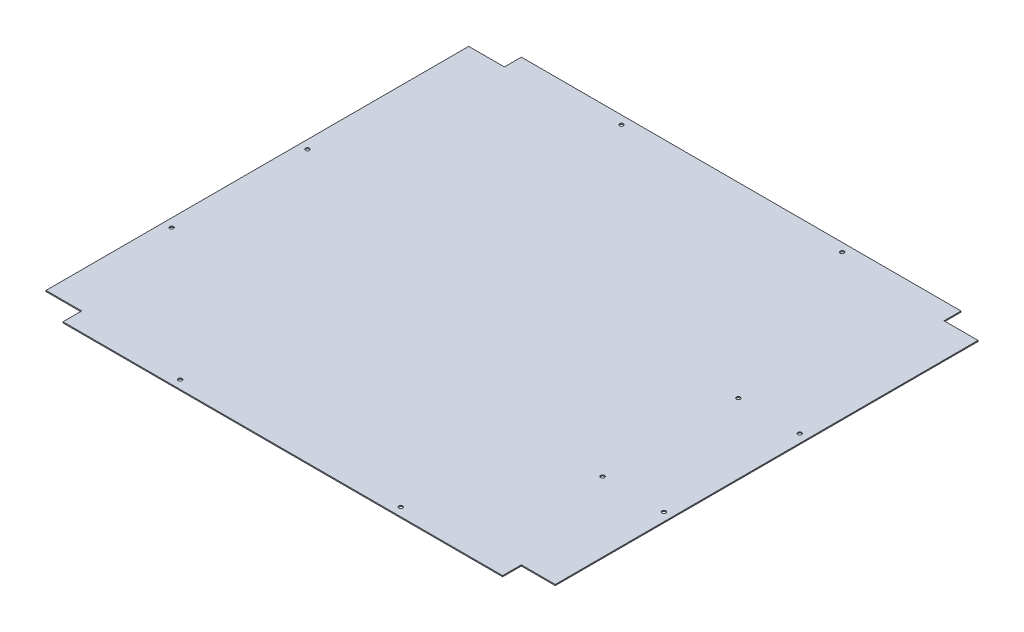
ISO-10303-21;
HEADER;
FILE_DESCRIPTION(('STEP AP214'),'2;1');
FILE_NAME('part.step','',(''),(''),'','','');
FILE_SCHEMA(('AUTOMOTIVE_DESIGN { 1 0 10303 214 1 1 1 1 }'));
ENDSEC;
DATA;
#1=APPLICATION_CONTEXT('core data for automotive mechanical design processes');
#2=APPLICATION_PROTOCOL_DEFINITION('international standard','automotive_design',2000,#1);
#3=PRODUCT_CONTEXT('',#1,'mechanical');
#4=PRODUCT('Part','Part','',(#3));
#5=PRODUCT_RELATED_PRODUCT_CATEGORY('part','',(#4));
#6=PRODUCT_DEFINITION_FORMATION('','',#4);
#7=PRODUCT_DEFINITION_CONTEXT('part definition',#1,'design');
#8=PRODUCT_DEFINITION('design','',#6,#7);
#9=PRODUCT_DEFINITION_SHAPE('','',#8);
#10=(LENGTH_UNIT() NAMED_UNIT(*) SI_UNIT(.MILLI.,.METRE.));
#11=(NAMED_UNIT(*) PLANE_ANGLE_UNIT() SI_UNIT($,.RADIAN.));
#12=(NAMED_UNIT(*) SI_UNIT($,.STERADIAN.) SOLID_ANGLE_UNIT());
#13=UNCERTAINTY_MEASURE_WITH_UNIT(LENGTH_MEASURE(1.E-05),#10,'distance_accuracy_value','');
#14=(GEOMETRIC_REPRESENTATION_CONTEXT(3) GLOBAL_UNCERTAINTY_ASSIGNED_CONTEXT((#13)) GLOBAL_UNIT_ASSIGNED_CONTEXT((#10,
#11,#12)) REPRESENTATION_CONTEXT('',''));
#15=CARTESIAN_POINT('',(0.,0.,0.));
#16=DIRECTION('',(0.,0.,1.));
#17=DIRECTION('',(1.,0.,0.));
#18=AXIS2_PLACEMENT_3D('',#15,#16,#17);
#19=CARTESIAN_POINT('',(0.,-1.5875,0.));
#20=DIRECTION('',(-1.,0.,0.));
#21=DIRECTION('',(0.,0.,1.));
#22=AXIS2_PLACEMENT_3D('',#19,#20,#21);
#23=PLANE('',#22);
#24=DIRECTION('',(0.,0.,1.));
#25=VECTOR('',#24,1.);
#26=CARTESIAN_POINT('',(0.,-1.5875,0.));
#27=LINE('',#26,#25);
#28=CARTESIAN_POINT('',(0.,-1.5875,-660.4));
#29=VERTEX_POINT('',#28);
#30=CARTESIAN_POINT('',(0.,-1.5875,-27.94));
#31=VERTEX_POINT('',#30);
#32=EDGE_CURVE('E261',#29,#31,#27,.T.);
#33=ORIENTED_EDGE('',*,*,#32,.F.);
#34=DIRECTION('',(0.,1.,0.));
#35=VECTOR('',#34,1.);
#36=CARTESIAN_POINT('',(0.,-1.5875,-660.4));
#37=LINE('',#36,#35);
#38=CARTESIAN_POINT('',(0.,0.,-660.4));
#39=VERTEX_POINT('',#38);
#40=EDGE_CURVE('E128',#29,#39,#37,.T.);
#41=ORIENTED_EDGE('',*,*,#40,.T.);
#42=DIRECTION('',(0.,0.,1.));
#43=VECTOR('',#42,1.);
#44=CARTESIAN_POINT('',(0.,0.,0.));
#45=LINE('',#44,#43);
#46=CARTESIAN_POINT('',(0.,0.,-27.94));
#47=VERTEX_POINT('',#46);
#48=EDGE_CURVE('E57',#39,#47,#45,.T.);
#49=ORIENTED_EDGE('',*,*,#48,.T.);
#50=DIRECTION('',(0.,-1.,0.));
#51=VECTOR('',#50,1.);
#52=CARTESIAN_POINT('',(0.,-1.5875,-27.94));
#53=LINE('',#52,#51);
#54=EDGE_CURVE('E163',#47,#31,#53,.T.);
#55=ORIENTED_EDGE('',*,*,#54,.T.);
#56=EDGE_LOOP('',(#33,#41,#49,#55));
#57=FACE_BOUND('',#56,.T.);
#58=ADVANCED_FACE('F35',(#57),#23,.F.);
#59=CARTESIAN_POINT('',(0.,-1.5875,0.));
#60=DIRECTION('',(0.,0.,-1.));
#61=DIRECTION('',(-1.,0.,0.));
#62=AXIS2_PLACEMENT_3D('',#59,#60,#61);
#63=PLANE('',#62);
#64=DIRECTION('',(-1.,0.,0.));
#65=VECTOR('',#64,1.);
#66=CARTESIAN_POINT('',(0.,-1.5875,0.));
#67=LINE('',#66,#65);
#68=CARTESIAN_POINT('',(-50.8000000000001,-1.5875,0.));
#69=VERTEX_POINT('',#68);
#70=CARTESIAN_POINT('',(-708.66,-1.5875,0.));
#71=VERTEX_POINT('',#70);
#72=EDGE_CURVE('E263',#69,#71,#67,.T.);
#73=ORIENTED_EDGE('',*,*,#72,.F.);
#74=DIRECTION('',(0.,-1.,0.));
#75=VECTOR('',#74,1.);
#76=CARTESIAN_POINT('',(-50.8000000000001,0.,0.));
#77=LINE('',#76,#75);
#78=CARTESIAN_POINT('',(-50.8000000000001,0.,0.));
#79=VERTEX_POINT('',#78);
#80=EDGE_CURVE('E161',#79,#69,#77,.T.);
#81=ORIENTED_EDGE('',*,*,#80,.F.);
#82=DIRECTION('',(-1.,0.,0.));
#83=VECTOR('',#82,1.);
#84=CARTESIAN_POINT('',(0.,0.,0.));
#85=LINE('',#84,#83);
#86=CARTESIAN_POINT('',(-708.66,0.,0.));
#87=VERTEX_POINT('',#86);
#88=EDGE_CURVE('E271',#79,#87,#85,.T.);
#89=ORIENTED_EDGE('',*,*,#88,.T.);
#90=DIRECTION('',(0.,-1.,0.));
#91=VECTOR('',#90,1.);
#92=CARTESIAN_POINT('',(-708.66,0.,0.));
#93=LINE('',#92,#91);
#94=EDGE_CURVE('E195',#87,#71,#93,.T.);
#95=ORIENTED_EDGE('',*,*,#94,.T.);
#96=EDGE_LOOP('',(#73,#81,#89,#95));
#97=FACE_BOUND('',#96,.T.);
#98=ADVANCED_FACE('F298',(#97),#63,.F.);
#99=CARTESIAN_POINT('',(-762.,-1.5875,0.));
#100=DIRECTION('',(1.,0.,0.));
#101=DIRECTION('',(0.,0.,-1.));
#102=AXIS2_PLACEMENT_3D('',#99,#100,#101);
#103=PLANE('',#102);
#104=DIRECTION('',(0.,0.,-1.));
#105=VECTOR('',#104,1.);
#106=CARTESIAN_POINT('',(-762.,0.,0.));
#107=LINE('',#106,#105);
#108=CARTESIAN_POINT('',(-762.,0.,-27.94));
#109=VERTEX_POINT('',#108);
#110=CARTESIAN_POINT('',(-762.,0.,-660.4));
#111=VERTEX_POINT('',#110);
#112=EDGE_CURVE('E273',#109,#111,#107,.T.);
#113=ORIENTED_EDGE('',*,*,#112,.T.);
#114=DIRECTION('',(0.,-1.,0.));
#115=VECTOR('',#114,1.);
#116=CARTESIAN_POINT('',(-762.,0.,-660.4));
#117=LINE('',#116,#115);
#118=CARTESIAN_POINT('',(-762.,-1.5875,-660.4));
#119=VERTEX_POINT('',#118);
#120=EDGE_CURVE('E174',#111,#119,#117,.T.);
#121=ORIENTED_EDGE('',*,*,#120,.T.);
#122=DIRECTION('',(0.,0.,-1.));
#123=VECTOR('',#122,1.);
#124=CARTESIAN_POINT('',(-762.,-1.5875,0.));
#125=LINE('',#124,#123);
#126=CARTESIAN_POINT('',(-762.,-1.5875,-27.94));
#127=VERTEX_POINT('',#126);
#128=EDGE_CURVE('E266',#127,#119,#125,.T.);
#129=ORIENTED_EDGE('',*,*,#128,.F.);
#130=DIRECTION('',(0.,-1.,0.));
#131=VECTOR('',#130,1.);
#132=CARTESIAN_POINT('',(-762.,0.,-27.94));
#133=LINE('',#132,#131);
#134=EDGE_CURVE('E190',#109,#127,#133,.T.);
#135=ORIENTED_EDGE('',*,*,#134,.F.);
#136=EDGE_LOOP('',(#113,#121,#129,#135));
#137=FACE_BOUND('',#136,.T.);
#138=ADVANCED_FACE('F311',(#137),#103,.F.);
#139=CARTESIAN_POINT('',(0.,-1.5875,-685.8));
#140=DIRECTION('',(0.,0.,1.));
#141=DIRECTION('',(1.,0.,0.));
#142=AXIS2_PLACEMENT_3D('',#139,#140,#141);
#143=PLANE('',#142);
#144=DIRECTION('',(1.,0.,0.));
#145=VECTOR('',#144,1.);
#146=CARTESIAN_POINT('',(0.,0.,-685.8));
#147=LINE('',#146,#145);
#148=CARTESIAN_POINT('',(-708.66,0.,-685.8));
#149=VERTEX_POINT('',#148);
#150=CARTESIAN_POINT('',(-50.8000000000001,0.,-685.8));
#151=VERTEX_POINT('',#150);
#152=EDGE_CURVE('E264',#149,#151,#147,.T.);
#153=ORIENTED_EDGE('',*,*,#152,.T.);
#154=DIRECTION('',(0.,-1.,0.));
#155=VECTOR('',#154,1.);
#156=CARTESIAN_POINT('',(-50.8000000000001,-1.5875,-685.8));
#157=LINE('',#156,#155);
#158=CARTESIAN_POINT('',(-50.8000000000001,-1.5875,-685.8));
#159=VERTEX_POINT('',#158);
#160=EDGE_CURVE('E146',#151,#159,#157,.T.);
#161=ORIENTED_EDGE('',*,*,#160,.T.);
#162=DIRECTION('',(1.,0.,0.));
#163=VECTOR('',#162,1.);
#164=CARTESIAN_POINT('',(0.,-1.5875,-685.8));
#165=LINE('',#164,#163);
#166=CARTESIAN_POINT('',(-708.66,-1.5875,-685.8));
#167=VERTEX_POINT('',#166);
#168=EDGE_CURVE('E141',#167,#159,#165,.T.);
#169=ORIENTED_EDGE('',*,*,#168,.F.);
#170=DIRECTION('',(0.,1.,0.));
#171=VECTOR('',#170,1.);
#172=CARTESIAN_POINT('',(-708.66,-1.5875,-685.8));
#173=LINE('',#172,#171);
#174=EDGE_CURVE('E177',#167,#149,#173,.T.);
#175=ORIENTED_EDGE('',*,*,#174,.T.);
#176=EDGE_LOOP('',(#153,#161,#169,#175));
#177=FACE_BOUND('',#176,.T.);
#178=ADVANCED_FACE('F284',(#177),#143,.F.);
#179=CARTESIAN_POINT('',(0.,-1.5875,-685.8));
#180=DIRECTION('',(0.,1.,0.));
#181=DIRECTION('',(0.,0.,1.));
#182=AXIS2_PLACEMENT_3D('',#179,#180,#181);
#183=PLANE('',#182);
#184=CARTESIAN_POINT('',(-546.1,-1.5875,-12.7));
#185=DIRECTION('',(0.,-1.,0.));
#186=DIRECTION('',(0.,0.,-1.));
#187=AXIS2_PLACEMENT_3D('',#184,#185,#186);
#188=CIRCLE('',#187,2.90000000000001);
#189=CARTESIAN_POINT('',(-546.1,-1.5875,-15.6));
#190=VERTEX_POINT('',#189);
#191=EDGE_CURVE('E198',#190,#190,#188,.T.);
#192=ORIENTED_EDGE('',*,*,#191,.F.);
#193=EDGE_LOOP('',(#192));
#194=FACE_BOUND('',#193,.T.);
#195=CARTESIAN_POINT('',(-215.9,-1.5875,-12.7));
#196=DIRECTION('',(0.,-1.,0.));
#197=DIRECTION('',(0.,0.,-1.));
#198=AXIS2_PLACEMENT_3D('',#195,#196,#197);
#199=CIRCLE('',#198,2.89999999999999);
#200=CARTESIAN_POINT('',(-215.9,-1.5875,-15.6));
#201=VERTEX_POINT('',#200);
#202=EDGE_CURVE('E207',#201,#201,#199,.T.);
#203=ORIENTED_EDGE('',*,*,#202,.F.);
#204=EDGE_LOOP('',(#203));
#205=FACE_BOUND('',#204,.T.);
#206=CARTESIAN_POINT('',(-215.9,-1.5875,-673.1));
#207=DIRECTION('',(0.,-1.,0.));
#208=DIRECTION('',(0.,0.,-1.));
#209=AXIS2_PLACEMENT_3D('',#206,#207,#208);
#210=CIRCLE('',#209,2.89999999999999);
#211=CARTESIAN_POINT('',(-215.9,-1.5875,-676.));
#212=VERTEX_POINT('',#211);
#213=EDGE_CURVE('E213',#212,#212,#210,.T.);
#214=ORIENTED_EDGE('',*,*,#213,.F.);
#215=EDGE_LOOP('',(#214));
#216=FACE_BOUND('',#215,.T.);
#217=CARTESIAN_POINT('',(-546.1,-1.5875,-673.1));
#218=DIRECTION('',(0.,-1.,0.));
#219=DIRECTION('',(0.,0.,-1.));
#220=AXIS2_PLACEMENT_3D('',#217,#218,#219);
#221=CIRCLE('',#220,2.90000000000001);
#222=CARTESIAN_POINT('',(-546.1,-1.5875,-676.));
#223=VERTEX_POINT('',#222);
#224=EDGE_CURVE('E219',#223,#223,#221,.T.);
#225=ORIENTED_EDGE('',*,*,#224,.F.);
#226=EDGE_LOOP('',(#225));
#227=FACE_BOUND('',#226,.T.);
#228=CARTESIAN_POINT('',(-749.3,-1.5875,-406.4));
#229=DIRECTION('',(0.,-1.,0.));
#230=DIRECTION('',(0.,0.,-1.));
#231=AXIS2_PLACEMENT_3D('',#228,#229,#230);
#232=CIRCLE('',#231,2.90000000000001);
#233=CARTESIAN_POINT('',(-749.3,-1.5875,-409.3));
#234=VERTEX_POINT('',#233);
#235=EDGE_CURVE('E228',#234,#234,#232,.T.);
#236=ORIENTED_EDGE('',*,*,#235,.F.);
#237=EDGE_LOOP('',(#236));
#238=FACE_BOUND('',#237,.T.);
#239=CARTESIAN_POINT('',(-12.7,-1.5875,-406.4));
#240=DIRECTION('',(0.,-1.,0.));
#241=DIRECTION('',(0.,0.,-1.));
#242=AXIS2_PLACEMENT_3D('',#239,#240,#241);
#243=CIRCLE('',#242,2.89999999999999);
#244=CARTESIAN_POINT('',(-12.7,-1.5875,-409.3));
#245=VERTEX_POINT('',#244);
#246=EDGE_CURVE('E234',#245,#245,#243,.T.);
#247=ORIENTED_EDGE('',*,*,#246,.F.);
#248=EDGE_LOOP('',(#247));
#249=FACE_BOUND('',#248,.T.);
#250=CARTESIAN_POINT('',(-104.445466719497,-1.5875,-406.4));
#251=DIRECTION('',(0.,-1.,0.));
#252=DIRECTION('',(0.,0.,-1.));
#253=AXIS2_PLACEMENT_3D('',#250,#251,#252);
#254=CIRCLE('',#253,2.89999999999999);
#255=CARTESIAN_POINT('',(-104.445466719497,-1.5875,-409.3));
#256=VERTEX_POINT('',#255);
#257=EDGE_CURVE('E240',#256,#256,#254,.T.);
#258=ORIENTED_EDGE('',*,*,#257,.F.);
#259=EDGE_LOOP('',(#258));
#260=FACE_BOUND('',#259,.T.);
#261=CARTESIAN_POINT('',(-104.445466719497,-1.5875,-203.2));
#262=DIRECTION('',(0.,-1.,0.));
#263=DIRECTION('',(0.,0.,-1.));
#264=AXIS2_PLACEMENT_3D('',#261,#262,#263);
#265=CIRCLE('',#264,2.89999999999999);
#266=CARTESIAN_POINT('',(-104.445466719497,-1.5875,-206.1));
#267=VERTEX_POINT('',#266);
#268=EDGE_CURVE('E243',#267,#267,#265,.T.);
#269=ORIENTED_EDGE('',*,*,#268,.F.);
#270=EDGE_LOOP('',(#269));
#271=FACE_BOUND('',#270,.T.);
#272=CARTESIAN_POINT('',(-749.3,-1.5875,-203.2));
#273=DIRECTION('',(0.,-1.,0.));
#274=DIRECTION('',(0.,0.,-1.));
#275=AXIS2_PLACEMENT_3D('',#272,#273,#274);
#276=CIRCLE('',#275,2.90000000000001);
#277=CARTESIAN_POINT('',(-749.3,-1.5875,-206.1));
#278=VERTEX_POINT('',#277);
#279=EDGE_CURVE('E249',#278,#278,#276,.T.);
#280=ORIENTED_EDGE('',*,*,#279,.F.);
#281=EDGE_LOOP('',(#280));
#282=FACE_BOUND('',#281,.T.);
#283=CARTESIAN_POINT('',(-12.7,-1.5875,-203.2));
#284=DIRECTION('',(0.,-1.,0.));
#285=DIRECTION('',(0.,0.,-1.));
#286=AXIS2_PLACEMENT_3D('',#283,#284,#285);
#287=CIRCLE('',#286,2.89999999999999);
#288=CARTESIAN_POINT('',(-12.7,-1.5875,-206.1));
#289=VERTEX_POINT('',#288);
#290=EDGE_CURVE('E255',#289,#289,#287,.T.);
#291=ORIENTED_EDGE('',*,*,#290,.F.);
#292=EDGE_LOOP('',(#291));
#293=FACE_BOUND('',#292,.T.);
#294=ORIENTED_EDGE('',*,*,#168,.T.);
#295=DIRECTION('',(0.,0.,-1.));
#296=VECTOR('',#295,1.);
#297=CARTESIAN_POINT('',(-50.8000000000001,-1.5875,-660.4));
#298=LINE('',#297,#296);
#299=CARTESIAN_POINT('',(-50.8000000000001,-1.5875,-660.4));
#300=VERTEX_POINT('',#299);
#301=EDGE_CURVE('E132',#300,#159,#298,.T.);
#302=ORIENTED_EDGE('',*,*,#301,.F.);
#303=DIRECTION('',(-1.,0.,0.));
#304=VECTOR('',#303,1.);
#305=CARTESIAN_POINT('',(-50.8000000000001,-1.5875,-660.4));
#306=LINE('',#305,#304);
#307=EDGE_CURVE('E124',#29,#300,#306,.T.);
#308=ORIENTED_EDGE('',*,*,#307,.F.);
#309=ORIENTED_EDGE('',*,*,#32,.T.);
#310=DIRECTION('',(1.,0.,0.));
#311=VECTOR('',#310,1.);
#312=CARTESIAN_POINT('',(-50.8000000000001,-1.5875,-27.94));
#313=LINE('',#312,#311);
#314=CARTESIAN_POINT('',(-50.8000000000001,-1.5875,-27.94));
#315=VERTEX_POINT('',#314);
#316=EDGE_CURVE('E153',#315,#31,#313,.T.);
#317=ORIENTED_EDGE('',*,*,#316,.F.);
#318=DIRECTION('',(0.,0.,-1.));
#319=VECTOR('',#318,1.);
#320=CARTESIAN_POINT('',(-50.8000000000001,-1.5875,0.));
#321=LINE('',#320,#319);
#322=EDGE_CURVE('E148',#69,#315,#321,.T.);
#323=ORIENTED_EDGE('',*,*,#322,.F.);
#324=ORIENTED_EDGE('',*,*,#72,.T.);
#325=DIRECTION('',(0.,0.,1.));
#326=VECTOR('',#325,1.);
#327=CARTESIAN_POINT('',(-708.66,-1.5875,0.));
#328=LINE('',#327,#326);
#329=CARTESIAN_POINT('',(-708.66,-1.5875,-27.94));
#330=VERTEX_POINT('',#329);
#331=EDGE_CURVE('E187',#330,#71,#328,.T.);
#332=ORIENTED_EDGE('',*,*,#331,.F.);
#333=DIRECTION('',(1.,0.,0.));
#334=VECTOR('',#333,1.);
#335=CARTESIAN_POINT('',(-762.,-1.5875,-27.94));
#336=LINE('',#335,#334);
#337=EDGE_CURVE('E182',#127,#330,#336,.T.);
#338=ORIENTED_EDGE('',*,*,#337,.F.);
#339=ORIENTED_EDGE('',*,*,#128,.T.);
#340=DIRECTION('',(-1.,0.,0.));
#341=VECTOR('',#340,1.);
#342=CARTESIAN_POINT('',(-762.,-1.5875,-660.4));
#343=LINE('',#342,#341);
#344=CARTESIAN_POINT('',(-708.66,-1.5875,-660.4));
#345=VERTEX_POINT('',#344);
#346=EDGE_CURVE('E171',#345,#119,#343,.T.);
#347=ORIENTED_EDGE('',*,*,#346,.F.);
#348=DIRECTION('',(0.,0.,1.));
#349=VECTOR('',#348,1.);
#350=CARTESIAN_POINT('',(-708.66,-1.5875,-660.4));
#351=LINE('',#350,#349);
#352=EDGE_CURVE('E166',#167,#345,#351,.T.);
#353=ORIENTED_EDGE('',*,*,#352,.F.);
#354=EDGE_LOOP('',(#294,#302,#308,#309,#317,#323,#324,#332,#338,#339,#347,#353));
#355=FACE_BOUND('',#354,.T.);
#356=ADVANCED_FACE('F138',(#194,#205,#216,#227,#238,#249,#260,#271,#282,#293,#355),#183,.F.);
#357=CARTESIAN_POINT('',(0.,0.,-685.8));
#358=DIRECTION('',(0.,1.,0.));
#359=DIRECTION('',(0.,0.,1.));
#360=AXIS2_PLACEMENT_3D('',#357,#358,#359);
#361=PLANE('',#360);
#362=DIRECTION('',(0.,0.,-1.));
#363=VECTOR('',#362,1.);
#364=CARTESIAN_POINT('',(-50.8000000000001,0.,-660.4));
#365=LINE('',#364,#363);
#366=CARTESIAN_POINT('',(-50.8000000000001,0.,-660.4));
#367=VERTEX_POINT('',#366);
#368=EDGE_CURVE('E49',#367,#151,#365,.T.);
#369=ORIENTED_EDGE('',*,*,#368,.T.);
#370=ORIENTED_EDGE('',*,*,#152,.F.);
#371=DIRECTION('',(0.,0.,-1.));
#372=VECTOR('',#371,1.);
#373=CARTESIAN_POINT('',(-708.66,0.,-685.8));
#374=LINE('',#373,#372);
#375=CARTESIAN_POINT('',(-708.66,0.,-660.4));
#376=VERTEX_POINT('',#375);
#377=EDGE_CURVE('E42',#376,#149,#374,.T.);
#378=ORIENTED_EDGE('',*,*,#377,.F.);
#379=DIRECTION('',(-1.,0.,0.));
#380=VECTOR('',#379,1.);
#381=CARTESIAN_POINT('',(-762.,0.,-660.4));
#382=LINE('',#381,#380);
#383=EDGE_CURVE('E167',#376,#111,#382,.T.);
#384=ORIENTED_EDGE('',*,*,#383,.T.);
#385=ORIENTED_EDGE('',*,*,#112,.F.);
#386=DIRECTION('',(1.,0.,0.));
#387=VECTOR('',#386,1.);
#388=CARTESIAN_POINT('',(-762.,0.,-27.94));
#389=LINE('',#388,#387);
#390=CARTESIAN_POINT('',(-708.66,0.,-27.94));
#391=VERTEX_POINT('',#390);
#392=EDGE_CURVE('E183',#109,#391,#389,.T.);
#393=ORIENTED_EDGE('',*,*,#392,.T.);
#394=DIRECTION('',(0.,0.,1.));
#395=VECTOR('',#394,1.);
#396=CARTESIAN_POINT('',(-708.66,0.,0.));
#397=LINE('',#396,#395);
#398=EDGE_CURVE('E186',#391,#87,#397,.T.);
#399=ORIENTED_EDGE('',*,*,#398,.T.);
#400=ORIENTED_EDGE('',*,*,#88,.F.);
#401=DIRECTION('',(0.,0.,-1.));
#402=VECTOR('',#401,1.);
#403=CARTESIAN_POINT('',(-50.8000000000001,0.,0.));
#404=LINE('',#403,#402);
#405=CARTESIAN_POINT('',(-50.8000000000001,0.,-27.94));
#406=VERTEX_POINT('',#405);
#407=EDGE_CURVE('E149',#79,#406,#404,.T.);
#408=ORIENTED_EDGE('',*,*,#407,.T.);
#409=DIRECTION('',(1.,0.,0.));
#410=VECTOR('',#409,1.);
#411=CARTESIAN_POINT('',(-50.8000000000001,0.,-27.94));
#412=LINE('',#411,#410);
#413=EDGE_CURVE('E152',#406,#47,#412,.T.);
#414=ORIENTED_EDGE('',*,*,#413,.T.);
#415=ORIENTED_EDGE('',*,*,#48,.F.);
#416=DIRECTION('',(1.,0.,0.));
#417=VECTOR('',#416,1.);
#418=CARTESIAN_POINT('',(0.,0.,-660.4));
#419=LINE('',#418,#417);
#420=EDGE_CURVE('E11',#367,#39,#419,.T.);
#421=ORIENTED_EDGE('',*,*,#420,.F.);
#422=EDGE_LOOP('',(#369,#370,#378,#384,#385,#393,#399,#400,#408,#414,#415,#421));
#423=FACE_BOUND('',#422,.T.);
#424=CARTESIAN_POINT('',(-546.1,0.,-12.7));
#425=DIRECTION('',(0.,-1.,0.));
#426=DIRECTION('',(0.,0.,-1.));
#427=AXIS2_PLACEMENT_3D('',#424,#425,#426);
#428=CIRCLE('',#427,2.90000000000001);
#429=CARTESIAN_POINT('',(-546.1,0.,-15.6));
#430=VERTEX_POINT('',#429);
#431=EDGE_CURVE('E204',#430,#430,#428,.T.);
#432=ORIENTED_EDGE('',*,*,#431,.T.);
#433=EDGE_LOOP('',(#432));
#434=FACE_BOUND('',#433,.T.);
#435=CARTESIAN_POINT('',(-215.9,0.,-12.7));
#436=DIRECTION('',(0.,-1.,0.));
#437=DIRECTION('',(0.,0.,-1.));
#438=AXIS2_PLACEMENT_3D('',#435,#436,#437);
#439=CIRCLE('',#438,2.89999999999999);
#440=CARTESIAN_POINT('',(-215.9,0.,-15.6));
#441=VERTEX_POINT('',#440);
#442=EDGE_CURVE('E210',#441,#441,#439,.T.);
#443=ORIENTED_EDGE('',*,*,#442,.T.);
#444=EDGE_LOOP('',(#443));
#445=FACE_BOUND('',#444,.T.);
#446=CARTESIAN_POINT('',(-215.9,0.,-673.1));
#447=DIRECTION('',(0.,-1.,0.));
#448=DIRECTION('',(0.,0.,-1.));
#449=AXIS2_PLACEMENT_3D('',#446,#447,#448);
#450=CIRCLE('',#449,2.89999999999999);
#451=CARTESIAN_POINT('',(-215.9,0.,-676.));
#452=VERTEX_POINT('',#451);
#453=EDGE_CURVE('E216',#452,#452,#450,.T.);
#454=ORIENTED_EDGE('',*,*,#453,.T.);
#455=EDGE_LOOP('',(#454));
#456=FACE_BOUND('',#455,.T.);
#457=CARTESIAN_POINT('',(-546.1,0.,-673.1));
#458=DIRECTION('',(0.,-1.,0.));
#459=DIRECTION('',(0.,0.,-1.));
#460=AXIS2_PLACEMENT_3D('',#457,#458,#459);
#461=CIRCLE('',#460,2.90000000000001);
#462=CARTESIAN_POINT('',(-546.1,0.,-676.));
#463=VERTEX_POINT('',#462);
#464=EDGE_CURVE('E222',#463,#463,#461,.T.);
#465=ORIENTED_EDGE('',*,*,#464,.T.);
#466=EDGE_LOOP('',(#465));
#467=FACE_BOUND('',#466,.T.);
#468=CARTESIAN_POINT('',(-749.3,0.,-406.4));
#469=DIRECTION('',(0.,-1.,0.));
#470=DIRECTION('',(0.,0.,-1.));
#471=AXIS2_PLACEMENT_3D('',#468,#469,#470);
#472=CIRCLE('',#471,2.90000000000001);
#473=CARTESIAN_POINT('',(-749.3,0.,-409.3));
#474=VERTEX_POINT('',#473);
#475=EDGE_CURVE('E225',#474,#474,#472,.T.);
#476=ORIENTED_EDGE('',*,*,#475,.T.);
#477=EDGE_LOOP('',(#476));
#478=FACE_BOUND('',#477,.T.);
#479=CARTESIAN_POINT('',(-12.7,0.,-406.4));
#480=DIRECTION('',(0.,-1.,0.));
#481=DIRECTION('',(0.,0.,-1.));
#482=AXIS2_PLACEMENT_3D('',#479,#480,#481);
#483=CIRCLE('',#482,2.9);
#484=CARTESIAN_POINT('',(-12.7,0.,-409.3));
#485=VERTEX_POINT('',#484);
#486=EDGE_CURVE('E231',#485,#485,#483,.T.);
#487=ORIENTED_EDGE('',*,*,#486,.T.);
#488=EDGE_LOOP('',(#487));
#489=FACE_BOUND('',#488,.T.);
#490=CARTESIAN_POINT('',(-104.445466719497,0.,-406.4));
#491=DIRECTION('',(0.,-1.,0.));
#492=DIRECTION('',(0.,0.,-1.));
#493=AXIS2_PLACEMENT_3D('',#490,#491,#492);
#494=CIRCLE('',#493,2.9);
#495=CARTESIAN_POINT('',(-104.445466719497,0.,-409.3));
#496=VERTEX_POINT('',#495);
#497=EDGE_CURVE('E237',#496,#496,#494,.T.);
#498=ORIENTED_EDGE('',*,*,#497,.T.);
#499=EDGE_LOOP('',(#498));
#500=FACE_BOUND('',#499,.T.);
#501=CARTESIAN_POINT('',(-104.445466719497,0.,-203.2));
#502=DIRECTION('',(0.,-1.,0.));
#503=DIRECTION('',(0.,0.,-1.));
#504=AXIS2_PLACEMENT_3D('',#501,#502,#503);
#505=CIRCLE('',#504,2.9);
#506=CARTESIAN_POINT('',(-104.445466719497,0.,-206.1));
#507=VERTEX_POINT('',#506);
#508=EDGE_CURVE('E246',#507,#507,#505,.T.);
#509=ORIENTED_EDGE('',*,*,#508,.T.);
#510=EDGE_LOOP('',(#509));
#511=FACE_BOUND('',#510,.T.);
#512=CARTESIAN_POINT('',(-749.3,0.,-203.2));
#513=DIRECTION('',(0.,-1.,0.));
#514=DIRECTION('',(0.,0.,-1.));
#515=AXIS2_PLACEMENT_3D('',#512,#513,#514);
#516=CIRCLE('',#515,2.90000000000001);
#517=CARTESIAN_POINT('',(-749.3,0.,-206.1));
#518=VERTEX_POINT('',#517);
#519=EDGE_CURVE('E252',#518,#518,#516,.T.);
#520=ORIENTED_EDGE('',*,*,#519,.T.);
#521=EDGE_LOOP('',(#520));
#522=FACE_BOUND('',#521,.T.);
#523=CARTESIAN_POINT('',(-12.7,0.,-203.2));
#524=DIRECTION('',(0.,-1.,0.));
#525=DIRECTION('',(0.,0.,-1.));
#526=AXIS2_PLACEMENT_3D('',#523,#524,#525);
#527=CIRCLE('',#526,2.9);
#528=CARTESIAN_POINT('',(-12.7,0.,-206.1));
#529=VERTEX_POINT('',#528);
#530=EDGE_CURVE('E258',#529,#529,#527,.T.);
#531=ORIENTED_EDGE('',*,*,#530,.T.);
#532=EDGE_LOOP('',(#531));
#533=FACE_BOUND('',#532,.T.);
#534=ADVANCED_FACE('F285',(#423,#434,#445,#456,#467,#478,#489,#500,#511,#522,#533),#361,.T.);
#535=CARTESIAN_POINT('',(-12.7,-1.5875,-203.2));
#536=DIRECTION('',(0.,-1.,0.));
#537=DIRECTION('',(0.,0.,-1.));
#538=AXIS2_PLACEMENT_3D('',#535,#536,#537);
#539=CYLINDRICAL_SURFACE('',#538,2.89999999999999);
#540=ORIENTED_EDGE('',*,*,#530,.F.);
#541=EDGE_LOOP('',(#540));
#542=FACE_BOUND('',#541,.T.);
#543=ORIENTED_EDGE('',*,*,#290,.T.);
#544=EDGE_LOOP('',(#543));
#545=FACE_BOUND('',#544,.T.);
#546=ADVANCED_FACE('F337',(#542,#545),#539,.F.);
#547=CARTESIAN_POINT('',(-749.3,-1.5875,-203.2));
#548=DIRECTION('',(0.,-1.,0.));
#549=DIRECTION('',(0.,0.,-1.));
#550=AXIS2_PLACEMENT_3D('',#547,#548,#549);
#551=CYLINDRICAL_SURFACE('',#550,2.90000000000001);
#552=ORIENTED_EDGE('',*,*,#519,.F.);
#553=EDGE_LOOP('',(#552));
#554=FACE_BOUND('',#553,.T.);
#555=ORIENTED_EDGE('',*,*,#279,.T.);
#556=EDGE_LOOP('',(#555));
#557=FACE_BOUND('',#556,.T.);
#558=ADVANCED_FACE('F343',(#554,#557),#551,.F.);
#559=CARTESIAN_POINT('',(-104.445466719497,-1.5875,-203.2));
#560=DIRECTION('',(0.,-1.,0.));
#561=DIRECTION('',(0.,0.,-1.));
#562=AXIS2_PLACEMENT_3D('',#559,#560,#561);
#563=CYLINDRICAL_SURFACE('',#562,2.89999999999999);
#564=ORIENTED_EDGE('',*,*,#508,.F.);
#565=EDGE_LOOP('',(#564));
#566=FACE_BOUND('',#565,.T.);
#567=ORIENTED_EDGE('',*,*,#268,.T.);
#568=EDGE_LOOP('',(#567));
#569=FACE_BOUND('',#568,.T.);
#570=ADVANCED_FACE('F347',(#566,#569),#563,.F.);
#571=CARTESIAN_POINT('',(-104.445466719497,-1.5875,-406.4));
#572=DIRECTION('',(0.,-1.,0.));
#573=DIRECTION('',(0.,0.,-1.));
#574=AXIS2_PLACEMENT_3D('',#571,#572,#573);
#575=CYLINDRICAL_SURFACE('',#574,2.89999999999999);
#576=ORIENTED_EDGE('',*,*,#497,.F.);
#577=EDGE_LOOP('',(#576));
#578=FACE_BOUND('',#577,.T.);
#579=ORIENTED_EDGE('',*,*,#257,.T.);
#580=EDGE_LOOP('',(#579));
#581=FACE_BOUND('',#580,.T.);
#582=ADVANCED_FACE('F351',(#578,#581),#575,.F.);
#583=CARTESIAN_POINT('',(-12.7,-1.5875,-406.4));
#584=DIRECTION('',(0.,-1.,0.));
#585=DIRECTION('',(0.,0.,-1.));
#586=AXIS2_PLACEMENT_3D('',#583,#584,#585);
#587=CYLINDRICAL_SURFACE('',#586,2.89999999999999);
#588=ORIENTED_EDGE('',*,*,#486,.F.);
#589=EDGE_LOOP('',(#588));
#590=FACE_BOUND('',#589,.T.);
#591=ORIENTED_EDGE('',*,*,#246,.T.);
#592=EDGE_LOOP('',(#591));
#593=FACE_BOUND('',#592,.T.);
#594=ADVANCED_FACE('F355',(#590,#593),#587,.F.);
#595=CARTESIAN_POINT('',(-749.3,-1.5875,-406.4));
#596=DIRECTION('',(0.,-1.,0.));
#597=DIRECTION('',(0.,0.,-1.));
#598=AXIS2_PLACEMENT_3D('',#595,#596,#597);
#599=CYLINDRICAL_SURFACE('',#598,2.90000000000001);
#600=ORIENTED_EDGE('',*,*,#475,.F.);
#601=EDGE_LOOP('',(#600));
#602=FACE_BOUND('',#601,.T.);
#603=ORIENTED_EDGE('',*,*,#235,.T.);
#604=EDGE_LOOP('',(#603));
#605=FACE_BOUND('',#604,.T.);
#606=ADVANCED_FACE('F359',(#602,#605),#599,.F.);
#607=CARTESIAN_POINT('',(-546.1,-1.5875,-673.1));
#608=DIRECTION('',(0.,-1.,0.));
#609=DIRECTION('',(0.,0.,-1.));
#610=AXIS2_PLACEMENT_3D('',#607,#608,#609);
#611=CYLINDRICAL_SURFACE('',#610,2.90000000000001);
#612=ORIENTED_EDGE('',*,*,#464,.F.);
#613=EDGE_LOOP('',(#612));
#614=FACE_BOUND('',#613,.T.);
#615=ORIENTED_EDGE('',*,*,#224,.T.);
#616=EDGE_LOOP('',(#615));
#617=FACE_BOUND('',#616,.T.);
#618=ADVANCED_FACE('F363',(#614,#617),#611,.F.);
#619=CARTESIAN_POINT('',(-215.9,-1.5875,-673.1));
#620=DIRECTION('',(0.,-1.,0.));
#621=DIRECTION('',(0.,0.,-1.));
#622=AXIS2_PLACEMENT_3D('',#619,#620,#621);
#623=CYLINDRICAL_SURFACE('',#622,2.89999999999999);
#624=ORIENTED_EDGE('',*,*,#453,.F.);
#625=EDGE_LOOP('',(#624));
#626=FACE_BOUND('',#625,.T.);
#627=ORIENTED_EDGE('',*,*,#213,.T.);
#628=EDGE_LOOP('',(#627));
#629=FACE_BOUND('',#628,.T.);
#630=ADVANCED_FACE('F367',(#626,#629),#623,.F.);
#631=CARTESIAN_POINT('',(-215.9,-1.5875,-12.7));
#632=DIRECTION('',(0.,-1.,0.));
#633=DIRECTION('',(0.,0.,-1.));
#634=AXIS2_PLACEMENT_3D('',#631,#632,#633);
#635=CYLINDRICAL_SURFACE('',#634,2.89999999999999);
#636=ORIENTED_EDGE('',*,*,#442,.F.);
#637=EDGE_LOOP('',(#636));
#638=FACE_BOUND('',#637,.T.);
#639=ORIENTED_EDGE('',*,*,#202,.T.);
#640=EDGE_LOOP('',(#639));
#641=FACE_BOUND('',#640,.T.);
#642=ADVANCED_FACE('F371',(#638,#641),#635,.F.);
#643=CARTESIAN_POINT('',(-546.1,-1.5875,-12.7));
#644=DIRECTION('',(0.,-1.,0.));
#645=DIRECTION('',(0.,0.,-1.));
#646=AXIS2_PLACEMENT_3D('',#643,#644,#645);
#647=CYLINDRICAL_SURFACE('',#646,2.90000000000001);
#648=ORIENTED_EDGE('',*,*,#431,.F.);
#649=EDGE_LOOP('',(#648));
#650=FACE_BOUND('',#649,.T.);
#651=ORIENTED_EDGE('',*,*,#191,.T.);
#652=EDGE_LOOP('',(#651));
#653=FACE_BOUND('',#652,.T.);
#654=ADVANCED_FACE('F375',(#650,#653),#647,.F.);
#655=CARTESIAN_POINT('',(-708.66,0.,0.));
#656=DIRECTION('',(1.,0.,0.));
#657=DIRECTION('',(0.,0.,-1.));
#658=AXIS2_PLACEMENT_3D('',#655,#656,#657);
#659=PLANE('',#658);
#660=ORIENTED_EDGE('',*,*,#331,.T.);
#661=ORIENTED_EDGE('',*,*,#94,.F.);
#662=ORIENTED_EDGE('',*,*,#398,.F.);
#663=DIRECTION('',(0.,-1.,0.));
#664=VECTOR('',#663,1.);
#665=CARTESIAN_POINT('',(-708.66,0.,-27.94));
#666=LINE('',#665,#664);
#667=EDGE_CURVE('E199',#391,#330,#666,.T.);
#668=ORIENTED_EDGE('',*,*,#667,.T.);
#669=EDGE_LOOP('',(#660,#661,#662,#668));
#670=FACE_BOUND('',#669,.T.);
#671=ADVANCED_FACE('F302',(#670),#659,.F.);
#672=CARTESIAN_POINT('',(-762.,0.,-27.94));
#673=DIRECTION('',(0.,0.,-1.));
#674=DIRECTION('',(-1.,0.,0.));
#675=AXIS2_PLACEMENT_3D('',#672,#673,#674);
#676=PLANE('',#675);
#677=ORIENTED_EDGE('',*,*,#337,.T.);
#678=ORIENTED_EDGE('',*,*,#667,.F.);
#679=ORIENTED_EDGE('',*,*,#392,.F.);
#680=ORIENTED_EDGE('',*,*,#134,.T.);
#681=EDGE_LOOP('',(#677,#678,#679,#680));
#682=FACE_BOUND('',#681,.T.);
#683=ADVANCED_FACE('F307',(#682),#676,.F.);
#684=CARTESIAN_POINT('',(-708.66,0.,-660.4));
#685=DIRECTION('',(1.,0.,0.));
#686=DIRECTION('',(0.,0.,-1.));
#687=AXIS2_PLACEMENT_3D('',#684,#685,#686);
#688=PLANE('',#687);
#689=ORIENTED_EDGE('',*,*,#352,.T.);
#690=DIRECTION('',(0.,-1.,0.));
#691=VECTOR('',#690,1.);
#692=CARTESIAN_POINT('',(-708.66,0.,-660.4));
#693=LINE('',#692,#691);
#694=EDGE_CURVE('E170',#376,#345,#693,.T.);
#695=ORIENTED_EDGE('',*,*,#694,.F.);
#696=ORIENTED_EDGE('',*,*,#377,.T.);
#697=ORIENTED_EDGE('',*,*,#174,.F.);
#698=EDGE_LOOP('',(#689,#695,#696,#697));
#699=FACE_BOUND('',#698,.T.);
#700=ADVANCED_FACE('F280',(#699),#688,.F.);
#701=CARTESIAN_POINT('',(-762.,0.,-660.4));
#702=DIRECTION('',(0.,0.,1.));
#703=DIRECTION('',(1.,0.,0.));
#704=AXIS2_PLACEMENT_3D('',#701,#702,#703);
#705=PLANE('',#704);
#706=ORIENTED_EDGE('',*,*,#346,.T.);
#707=ORIENTED_EDGE('',*,*,#120,.F.);
#708=ORIENTED_EDGE('',*,*,#383,.F.);
#709=ORIENTED_EDGE('',*,*,#694,.T.);
#710=EDGE_LOOP('',(#706,#707,#708,#709));
#711=FACE_BOUND('',#710,.T.);
#712=ADVANCED_FACE('F314',(#711),#705,.F.);
#713=CARTESIAN_POINT('',(-50.8000000000001,0.,-27.94));
#714=DIRECTION('',(0.,0.,-1.));
#715=DIRECTION('',(-1.,0.,0.));
#716=AXIS2_PLACEMENT_3D('',#713,#714,#715);
#717=PLANE('',#716);
#718=ORIENTED_EDGE('',*,*,#413,.F.);
#719=DIRECTION('',(0.,-1.,0.));
#720=VECTOR('',#719,1.);
#721=CARTESIAN_POINT('',(-50.8000000000001,0.,-27.94));
#722=LINE('',#721,#720);
#723=EDGE_CURVE('E156',#406,#315,#722,.T.);
#724=ORIENTED_EDGE('',*,*,#723,.T.);
#725=ORIENTED_EDGE('',*,*,#316,.T.);
#726=ORIENTED_EDGE('',*,*,#54,.F.);
#727=EDGE_LOOP('',(#718,#724,#725,#726));
#728=FACE_BOUND('',#727,.T.);
#729=ADVANCED_FACE('F291',(#728),#717,.F.);
#730=CARTESIAN_POINT('',(-50.8000000000001,0.,0.));
#731=DIRECTION('',(-1.,0.,0.));
#732=DIRECTION('',(0.,0.,1.));
#733=AXIS2_PLACEMENT_3D('',#730,#731,#732);
#734=PLANE('',#733);
#735=ORIENTED_EDGE('',*,*,#322,.T.);
#736=ORIENTED_EDGE('',*,*,#723,.F.);
#737=ORIENTED_EDGE('',*,*,#407,.F.);
#738=ORIENTED_EDGE('',*,*,#80,.T.);
#739=EDGE_LOOP('',(#735,#736,#737,#738));
#740=FACE_BOUND('',#739,.T.);
#741=ADVANCED_FACE('F293',(#740),#734,.F.);
#742=CARTESIAN_POINT('',(-50.8000000000001,0.,-660.4));
#743=DIRECTION('',(-1.,0.,0.));
#744=DIRECTION('',(0.,0.,1.));
#745=AXIS2_PLACEMENT_3D('',#742,#743,#744);
#746=PLANE('',#745);
#747=ORIENTED_EDGE('',*,*,#368,.F.);
#748=DIRECTION('',(0.,-1.,0.));
#749=VECTOR('',#748,1.);
#750=CARTESIAN_POINT('',(-50.8000000000001,0.,-660.4));
#751=LINE('',#750,#749);
#752=EDGE_CURVE('E126',#367,#300,#751,.T.);
#753=ORIENTED_EDGE('',*,*,#752,.T.);
#754=ORIENTED_EDGE('',*,*,#301,.T.);
#755=ORIENTED_EDGE('',*,*,#160,.F.);
#756=EDGE_LOOP('',(#747,#753,#754,#755));
#757=FACE_BOUND('',#756,.T.);
#758=ADVANCED_FACE('F134',(#757),#746,.F.);
#759=CARTESIAN_POINT('',(-50.8000000000001,0.,-660.4));
#760=DIRECTION('',(0.,0.,1.));
#761=DIRECTION('',(1.,0.,0.));
#762=AXIS2_PLACEMENT_3D('',#759,#760,#761);
#763=PLANE('',#762);
#764=ORIENTED_EDGE('',*,*,#307,.T.);
#765=ORIENTED_EDGE('',*,*,#752,.F.);
#766=ORIENTED_EDGE('',*,*,#420,.T.);
#767=ORIENTED_EDGE('',*,*,#40,.F.);
#768=EDGE_LOOP('',(#764,#765,#766,#767));
#769=FACE_BOUND('',#768,.T.);
#770=ADVANCED_FACE('F125',(#769),#763,.F.);
#771=CLOSED_SHELL('',(#58,#98,#138,#178,#356,#534,#546,#558,#570,#582,#594,#606,#618,#630,#642,
#654,#671,#683,#700,#712,#729,#741,#758,#770));
#772=MANIFOLD_SOLID_BREP('B2',#771);
#773=ADVANCED_BREP_SHAPE_REPRESENTATION('',(#18,#772),#14);
#774=SHAPE_DEFINITION_REPRESENTATION(#9,#773);
ENDSEC;
END-ISO-10303-21;
